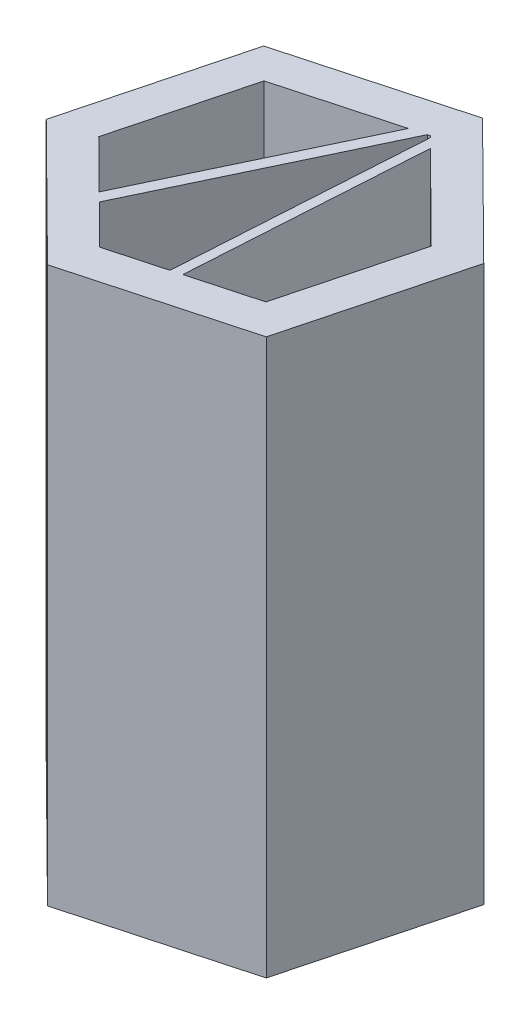
ISO-10303-21;
HEADER;
FILE_DESCRIPTION(('STEP AP214'),'2;1');
FILE_NAME('part.step','',(''),(''),'','','');
FILE_SCHEMA(('AUTOMOTIVE_DESIGN { 1 0 10303 214 1 1 1 1 }'));
ENDSEC;
DATA;
#1=APPLICATION_CONTEXT('core data for automotive mechanical design processes');
#2=APPLICATION_PROTOCOL_DEFINITION('international standard','automotive_design',2000,#1);
#3=PRODUCT_CONTEXT('',#1,'mechanical');
#4=PRODUCT('Part','Part','',(#3));
#5=PRODUCT_RELATED_PRODUCT_CATEGORY('part','',(#4));
#6=PRODUCT_DEFINITION_FORMATION('','',#4);
#7=PRODUCT_DEFINITION_CONTEXT('part definition',#1,'design');
#8=PRODUCT_DEFINITION('design','',#6,#7);
#9=PRODUCT_DEFINITION_SHAPE('','',#8);
#10=(LENGTH_UNIT() NAMED_UNIT(*) SI_UNIT(.MILLI.,.METRE.));
#11=(NAMED_UNIT(*) PLANE_ANGLE_UNIT() SI_UNIT($,.RADIAN.));
#12=(NAMED_UNIT(*) SI_UNIT($,.STERADIAN.) SOLID_ANGLE_UNIT());
#13=UNCERTAINTY_MEASURE_WITH_UNIT(LENGTH_MEASURE(1.E-05),#10,'distance_accuracy_value','');
#14=(GEOMETRIC_REPRESENTATION_CONTEXT(3) GLOBAL_UNCERTAINTY_ASSIGNED_CONTEXT((#13)) GLOBAL_UNIT_ASSIGNED_CONTEXT((#10,
#11,#12)) REPRESENTATION_CONTEXT('',''));
#15=CARTESIAN_POINT('',(0.,0.,0.));
#16=DIRECTION('',(0.,0.,1.));
#17=DIRECTION('',(1.,0.,0.));
#18=AXIS2_PLACEMENT_3D('',#15,#16,#17);
#19=CARTESIAN_POINT('',(-2.78587489391475,45.,10.6100063340598));
#20=DIRECTION('',(-0.263669614670392,0.,-0.964613048999217));
#21=DIRECTION('',(-0.964613048999218,0.,0.263669614670392));
#22=AXIS2_PLACEMENT_3D('',#19,#20,#21);
#23=PLANE('',#22);
#24=DIRECTION('',(0.,1.,0.));
#25=VECTOR('',#24,1.);
#26=CARTESIAN_POINT('',(1.68769548996965,0.,9.3871900135223));
#27=LINE('',#26,#25);
#28=CARTESIAN_POINT('',(1.68769548996966,0.,9.38719001352229));
#29=VERTEX_POINT('',#28);
#30=CARTESIAN_POINT('',(1.68769548996966,45.,9.38719001352229));
#31=VERTEX_POINT('',#30);
#32=EDGE_CURVE('E211',#29,#31,#27,.T.);
#33=ORIENTED_EDGE('',*,*,#32,.F.);
#34=DIRECTION('',(0.964613048999218,0.,-0.263669614670392));
#35=VECTOR('',#34,1.);
#36=CARTESIAN_POINT('',(-2.78587489391475,0.,10.6100063340598));
#37=LINE('',#36,#35);
#38=CARTESIAN_POINT('',(-2.78587489391475,0.,10.6100063340598));
#39=VERTEX_POINT('',#38);
#40=EDGE_CURVE('E275',#39,#29,#37,.T.);
#41=ORIENTED_EDGE('',*,*,#40,.F.);
#42=DIRECTION('',(0.,-1.,0.));
#43=VECTOR('',#42,1.);
#44=CARTESIAN_POINT('',(-2.78587489391475,45.,10.6100063340598));
#45=LINE('',#44,#43);
#46=CARTESIAN_POINT('',(-2.78587489391475,45.,10.6100063340598));
#47=VERTEX_POINT('',#46);
#48=EDGE_CURVE('E314',#47,#39,#45,.T.);
#49=ORIENTED_EDGE('',*,*,#48,.F.);
#50=DIRECTION('',(0.964613048999218,0.,-0.263669614670392));
#51=VECTOR('',#50,1.);
#52=CARTESIAN_POINT('',(-2.78587489391475,45.,10.6100063340598));
#53=LINE('',#52,#51);
#54=EDGE_CURVE('E55',#47,#31,#53,.T.);
#55=ORIENTED_EDGE('',*,*,#54,.T.);
#56=EDGE_LOOP('',(#33,#41,#49,#55));
#57=FACE_BOUND('',#56,.T.);
#58=ADVANCED_FACE('F39',(#57),#23,.T.);
#59=CARTESIAN_POINT('',(10.581472466567,45.,-2.89236473713444));
#60=DIRECTION('',(-0.703544597920089,0.,0.710651109010223));
#61=DIRECTION('',(0.710651109010223,0.,0.70354459792009));
#62=AXIS2_PLACEMENT_3D('',#59,#60,#61);
#63=PLANE('',#62);
#64=DIRECTION('',(0.,1.,0.));
#65=VECTOR('',#64,1.);
#66=CARTESIAN_POINT('',(2.92800511571679,0.,-10.4692974144758));
#67=LINE('',#66,#65);
#68=CARTESIAN_POINT('',(2.9280051157168,0.,-10.4692974144758));
#69=VERTEX_POINT('',#68);
#70=CARTESIAN_POINT('',(2.92800511571679,45.,-10.4692974144758));
#71=VERTEX_POINT('',#70);
#72=EDGE_CURVE('E215',#69,#71,#67,.T.);
#73=ORIENTED_EDGE('',*,*,#72,.T.);
#74=DIRECTION('',(-0.710651109010223,0.,-0.703544597920089));
#75=VECTOR('',#74,1.);
#76=CARTESIAN_POINT('',(10.581472466567,45.,-2.89236473713444));
#77=LINE('',#76,#75);
#78=CARTESIAN_POINT('',(2.78587489391475,45.,-10.6100063340598));
#79=VERTEX_POINT('',#78);
#80=EDGE_CURVE('E259',#71,#79,#77,.T.);
#81=ORIENTED_EDGE('',*,*,#80,.T.);
#82=DIRECTION('',(0.,-1.,0.));
#83=VECTOR('',#82,1.);
#84=CARTESIAN_POINT('',(2.78587489391475,45.,-10.6100063340598));
#85=LINE('',#84,#83);
#86=CARTESIAN_POINT('',(2.78587489391475,0.,-10.6100063340598));
#87=VERTEX_POINT('',#86);
#88=EDGE_CURVE('E304',#79,#87,#85,.T.);
#89=ORIENTED_EDGE('',*,*,#88,.T.);
#90=DIRECTION('',(-0.710651109010223,0.,-0.703544597920089));
#91=VECTOR('',#90,1.);
#92=CARTESIAN_POINT('',(10.581472466567,0.,-2.89236473713444));
#93=LINE('',#92,#91);
#94=EDGE_CURVE('E283',#69,#87,#93,.T.);
#95=ORIENTED_EDGE('',*,*,#94,.F.);
#96=EDGE_LOOP('',(#73,#81,#89,#95));
#97=FACE_BOUND('',#96,.T.);
#98=ADVANCED_FACE('F418',(#97),#63,.T.);
#99=CARTESIAN_POINT('',(-10.581472466567,45.,2.89236473713444));
#100=DIRECTION('',(0.70354459792009,0.,-0.710651109010223));
#101=DIRECTION('',(-0.710651109010223,0.,-0.70354459792009));
#102=AXIS2_PLACEMENT_3D('',#99,#100,#101);
#103=PLANE('',#102);
#104=DIRECTION('',(0.,1.,0.));
#105=VECTOR('',#104,1.);
#106=CARTESIAN_POINT('',(-6.68367368024085,0.,6.75118553559712));
#107=LINE('',#106,#105);
#108=CARTESIAN_POINT('',(-6.68367368024085,0.,6.75118553559712));
#109=VERTEX_POINT('',#108);
#110=CARTESIAN_POINT('',(-6.68367368024085,45.,6.75118553559712));
#111=VERTEX_POINT('',#110);
#112=EDGE_CURVE('E237',#109,#111,#107,.T.);
#113=ORIENTED_EDGE('',*,*,#112,.F.);
#114=DIRECTION('',(0.710651109010223,0.,0.70354459792009));
#115=VECTOR('',#114,1.);
#116=CARTESIAN_POINT('',(-10.581472466567,0.,2.89236473713444));
#117=LINE('',#116,#115);
#118=CARTESIAN_POINT('',(-10.581472466567,0.,2.89236473713444));
#119=VERTEX_POINT('',#118);
#120=EDGE_CURVE('E271',#119,#109,#117,.T.);
#121=ORIENTED_EDGE('',*,*,#120,.F.);
#122=DIRECTION('',(0.,-1.,0.));
#123=VECTOR('',#122,1.);
#124=CARTESIAN_POINT('',(-10.581472466567,45.,2.89236473713444));
#125=LINE('',#124,#123);
#126=CARTESIAN_POINT('',(-10.581472466567,45.,2.89236473713444));
#127=VERTEX_POINT('',#126);
#128=EDGE_CURVE('E270',#127,#119,#125,.T.);
#129=ORIENTED_EDGE('',*,*,#128,.F.);
#130=DIRECTION('',(0.710651109010223,0.,0.70354459792009));
#131=VECTOR('',#130,1.);
#132=CARTESIAN_POINT('',(-10.581472466567,45.,2.89236473713444));
#133=LINE('',#132,#131);
#134=EDGE_CURVE('E188',#127,#111,#133,.T.);
#135=ORIENTED_EDGE('',*,*,#134,.T.);
#136=EDGE_LOOP('',(#113,#121,#129,#135));
#137=FACE_BOUND('',#136,.T.);
#138=ADVANCED_FACE('F414',(#137),#103,.T.);
#139=CARTESIAN_POINT('',(2.78587489391475,45.,-10.6100063340598));
#140=DIRECTION('',(0.263669614670392,0.,0.964613048999218));
#141=DIRECTION('',(0.964613048999218,0.,-0.263669614670392));
#142=AXIS2_PLACEMENT_3D('',#139,#140,#141);
#143=PLANE('',#142);
#144=DIRECTION('',(0.,1.,0.));
#145=VECTOR('',#144,1.);
#146=CARTESIAN_POINT('',(1.39119043253521,0.,-10.2287799812749));
#147=LINE('',#146,#145);
#148=CARTESIAN_POINT('',(1.39119043253522,0.,-10.2287799812749));
#149=VERTEX_POINT('',#148);
#150=CARTESIAN_POINT('',(1.39119043253521,45.,-10.2287799812749));
#151=VERTEX_POINT('',#150);
#152=EDGE_CURVE('E242',#149,#151,#147,.T.);
#153=ORIENTED_EDGE('',*,*,#152,.T.);
#154=DIRECTION('',(-0.964613048999218,0.,0.263669614670392));
#155=VECTOR('',#154,1.);
#156=CARTESIAN_POINT('',(2.78587489391475,45.,-10.6100063340598));
#157=LINE('',#156,#155);
#158=CARTESIAN_POINT('',(-7.79559757265221,45.,-7.71764159692535));
#159=VERTEX_POINT('',#158);
#160=EDGE_CURVE('E263',#151,#159,#157,.T.);
#161=ORIENTED_EDGE('',*,*,#160,.T.);
#162=DIRECTION('',(0.,-1.,0.));
#163=VECTOR('',#162,1.);
#164=CARTESIAN_POINT('',(-7.79559757265221,45.,-7.71764159692535));
#165=LINE('',#164,#163);
#166=CARTESIAN_POINT('',(-7.79559757265221,0.,-7.71764159692535));
#167=VERTEX_POINT('',#166);
#168=EDGE_CURVE('E300',#159,#167,#165,.T.);
#169=ORIENTED_EDGE('',*,*,#168,.T.);
#170=DIRECTION('',(-0.964613048999218,0.,0.263669614670392));
#171=VECTOR('',#170,1.);
#172=CARTESIAN_POINT('',(2.78587489391475,0.,-10.6100063340598));
#173=LINE('',#172,#171);
#174=EDGE_CURVE('E288',#149,#167,#173,.T.);
#175=ORIENTED_EDGE('',*,*,#174,.F.);
#176=EDGE_LOOP('',(#153,#161,#169,#175));
#177=FACE_BOUND('',#176,.T.);
#178=ADVANCED_FACE('F444',(#177),#143,.T.);
#179=CARTESIAN_POINT('',(0.,45.,0.));
#180=DIRECTION('',(0.,1.,0.));
#181=DIRECTION('',(0.,0.,1.));
#182=AXIS2_PLACEMENT_3D('',#179,#180,#181);
#183=PLANE('',#182);
#184=CARTESIAN_POINT('',(2.50486133936873,45.,9.16382396549257));
#185=VERTEX_POINT('',#184);
#186=CARTESIAN_POINT('',(7.79559757265221,45.,7.71764159692535));
#187=VERTEX_POINT('',#186);
#188=EDGE_CURVE('E179',#185,#187,#53,.T.);
#189=ORIENTED_EDGE('',*,*,#188,.F.);
#190=DIRECTION('',(0.0623421952906192,0.,-0.99805483350683));
#191=VECTOR('',#190,1.);
#192=CARTESIAN_POINT('',(2.50486133936873,45.,9.16382396549257));
#193=LINE('',#192,#191);
#194=CARTESIAN_POINT('',(3.6844413873926,45.,-9.72042550551676));
#195=VERTEX_POINT('',#194);
#196=EDGE_CURVE('E184',#185,#195,#193,.T.);
#197=ORIENTED_EDGE('',*,*,#196,.T.);
#198=CARTESIAN_POINT('',(10.581472466567,45.,-2.89236473713444));
#199=VERTEX_POINT('',#198);
#200=EDGE_CURVE('E260',#199,#195,#77,.T.);
#201=ORIENTED_EDGE('',*,*,#200,.F.);
#202=DIRECTION('',(0.253961939988995,0.,-0.967214212590482));
#203=VECTOR('',#202,1.);
#204=CARTESIAN_POINT('',(7.79559757265221,45.,7.71764159692535));
#205=LINE('',#204,#203);
#206=EDGE_CURVE('E185',#187,#199,#205,.T.);
#207=ORIENTED_EDGE('',*,*,#206,.F.);
#208=EDGE_LOOP('',(#189,#197,#201,#207));
#209=FACE_BOUND('',#208,.T.);
#210=CARTESIAN_POINT('',(-5.97280295493348,45.,7.45494755365139));
#211=VERTEX_POINT('',#210);
#212=EDGE_CURVE('E254',#211,#47,#133,.T.);
#213=ORIENTED_EDGE('',*,*,#212,.F.);
#214=DIRECTION('',(0.429463831903045,0.,-0.903084058705032));
#215=VECTOR('',#214,1.);
#216=CARTESIAN_POINT('',(2.59295228411491,45.,-10.5572724111257));
#217=LINE('',#216,#215);
#218=CARTESIAN_POINT('',(2.59295228411491,45.,-10.5572724111257));
#219=VERTEX_POINT('',#218);
#220=EDGE_CURVE('E214',#211,#219,#217,.T.);
#221=ORIENTED_EDGE('',*,*,#220,.T.);
#222=EDGE_CURVE('E264',#79,#219,#157,.T.);
#223=ORIENTED_EDGE('',*,*,#222,.F.);
#224=ORIENTED_EDGE('',*,*,#80,.F.);
#225=DIRECTION('',(-0.0623421952906192,0.,0.99805483350683));
#226=VECTOR('',#225,1.);
#227=CARTESIAN_POINT('',(2.92800511571679,45.,-10.4692974144758));
#228=LINE('',#227,#226);
#229=EDGE_CURVE('E202',#71,#31,#228,.T.);
#230=ORIENTED_EDGE('',*,*,#229,.T.);
#231=ORIENTED_EDGE('',*,*,#54,.F.);
#232=EDGE_LOOP('',(#213,#221,#223,#224,#230,#231));
#233=FACE_BOUND('',#232,.T.);
#234=DIRECTION('',(0.964613048999218,0.,-0.263669614670393));
#235=VECTOR('',#234,1.);
#236=CARTESIAN_POINT('',(-3.66562486041414,45.,13.9605346500787));
#237=LINE('',#236,#235);
#238=CARTESIAN_POINT('',(-3.66562486041414,45.,13.9605346500787));
#239=VERTEX_POINT('',#238);
#240=CARTESIAN_POINT('',(10.257365227174,45.,10.1547915749018));
#241=VERTEX_POINT('',#240);
#242=EDGE_CURVE('E319',#239,#241,#237,.T.);
#243=ORIENTED_EDGE('',*,*,#242,.T.);
#244=DIRECTION('',(0.253961939988995,0.,-0.967214212590482));
#245=VECTOR('',#244,1.);
#246=CARTESIAN_POINT('',(10.257365227174,45.,10.1547915749018));
#247=LINE('',#246,#245);
#248=CARTESIAN_POINT('',(13.9229900875881,45.,-3.8057430751769));
#249=VERTEX_POINT('',#248);
#250=EDGE_CURVE('E323',#241,#249,#247,.T.);
#251=ORIENTED_EDGE('',*,*,#250,.T.);
#252=DIRECTION('',(-0.710651109010223,0.,-0.70354459792009));
#253=VECTOR('',#252,1.);
#254=CARTESIAN_POINT('',(13.9229900875881,45.,-3.8057430751769));
#255=LINE('',#254,#253);
#256=CARTESIAN_POINT('',(3.66562486041415,45.,-13.9605346500787));
#257=VERTEX_POINT('',#256);
#258=EDGE_CURVE('E327',#249,#257,#255,.T.);
#259=ORIENTED_EDGE('',*,*,#258,.T.);
#260=DIRECTION('',(-0.964613048999218,0.,0.263669614670392));
#261=VECTOR('',#260,1.);
#262=CARTESIAN_POINT('',(3.66562486041415,45.,-13.9605346500787));
#263=LINE('',#262,#261);
#264=CARTESIAN_POINT('',(-10.257365227174,45.,-10.1547915749018));
#265=VERTEX_POINT('',#264);
#266=EDGE_CURVE('E330',#257,#265,#263,.T.);
#267=ORIENTED_EDGE('',*,*,#266,.T.);
#268=DIRECTION('',(-0.253961939988995,0.,0.967214212590482));
#269=VECTOR('',#268,1.);
#270=CARTESIAN_POINT('',(-10.257365227174,45.,-10.1547915749018));
#271=LINE('',#270,#269);
#272=CARTESIAN_POINT('',(-13.9229900875881,45.,3.8057430751769));
#273=VERTEX_POINT('',#272);
#274=EDGE_CURVE('E333',#265,#273,#271,.T.);
#275=ORIENTED_EDGE('',*,*,#274,.T.);
#276=DIRECTION('',(0.710651109010223,0.,0.70354459792009));
#277=VECTOR('',#276,1.);
#278=CARTESIAN_POINT('',(-13.9229900875881,45.,3.8057430751769));
#279=LINE('',#278,#277);
#280=EDGE_CURVE('E336',#273,#239,#279,.T.);
#281=ORIENTED_EDGE('',*,*,#280,.T.);
#282=EDGE_LOOP('',(#243,#251,#259,#267,#275,#281));
#283=FACE_BOUND('',#282,.T.);
#284=DIRECTION('',(-0.429463831903045,0.,0.903084058705031));
#285=VECTOR('',#284,1.);
#286=CARTESIAN_POINT('',(-6.68367368024085,45.,6.75118553559712));
#287=LINE('',#286,#285);
#288=EDGE_CURVE('E226',#151,#111,#287,.T.);
#289=ORIENTED_EDGE('',*,*,#288,.T.);
#290=ORIENTED_EDGE('',*,*,#134,.F.);
#291=DIRECTION('',(-0.253961939988995,0.,0.967214212590482));
#292=VECTOR('',#291,1.);
#293=CARTESIAN_POINT('',(-7.79559757265221,45.,-7.71764159692535));
#294=LINE('',#293,#292);
#295=EDGE_CURVE('E267',#159,#127,#294,.T.);
#296=ORIENTED_EDGE('',*,*,#295,.F.);
#297=ORIENTED_EDGE('',*,*,#160,.F.);
#298=EDGE_LOOP('',(#289,#290,#296,#297));
#299=FACE_BOUND('',#298,.T.);
#300=ADVANCED_FACE('F180',(#209,#233,#283,#299),#183,.T.);
#301=CARTESIAN_POINT('',(0.,0.,0.));
#302=DIRECTION('',(0.,1.,0.));
#303=DIRECTION('',(0.,0.,1.));
#304=AXIS2_PLACEMENT_3D('',#301,#302,#303);
#305=PLANE('',#304);
#306=DIRECTION('',(0.0623421952906192,0.,-0.99805483350683));
#307=VECTOR('',#306,1.);
#308=CARTESIAN_POINT('',(2.50486133936873,0.,9.16382396549257));
#309=LINE('',#308,#307);
#310=CARTESIAN_POINT('',(2.50486133936873,0.,9.16382396549257));
#311=VERTEX_POINT('',#310);
#312=CARTESIAN_POINT('',(3.6844413873926,0.,-9.72042550551676));
#313=VERTEX_POINT('',#312);
#314=EDGE_CURVE('E206',#311,#313,#309,.T.);
#315=ORIENTED_EDGE('',*,*,#314,.F.);
#316=CARTESIAN_POINT('',(7.79559757265221,0.,7.71764159692535));
#317=VERTEX_POINT('',#316);
#318=EDGE_CURVE('E63',#311,#317,#37,.T.);
#319=ORIENTED_EDGE('',*,*,#318,.T.);
#320=DIRECTION('',(0.253961939988995,0.,-0.967214212590482));
#321=VECTOR('',#320,1.);
#322=CARTESIAN_POINT('',(7.79559757265221,0.,7.71764159692535));
#323=LINE('',#322,#321);
#324=CARTESIAN_POINT('',(10.581472466567,0.,-2.89236473713444));
#325=VERTEX_POINT('',#324);
#326=EDGE_CURVE('E279',#317,#325,#323,.T.);
#327=ORIENTED_EDGE('',*,*,#326,.T.);
#328=EDGE_CURVE('E284',#325,#313,#93,.T.);
#329=ORIENTED_EDGE('',*,*,#328,.T.);
#330=EDGE_LOOP('',(#315,#319,#327,#329));
#331=FACE_BOUND('',#330,.T.);
#332=DIRECTION('',(0.429463831903045,0.,-0.903084058705032));
#333=VECTOR('',#332,1.);
#334=CARTESIAN_POINT('',(2.59295228411491,0.,-10.5572724111257));
#335=LINE('',#334,#333);
#336=CARTESIAN_POINT('',(-5.97280295493348,0.,7.45494755365139));
#337=VERTEX_POINT('',#336);
#338=CARTESIAN_POINT('',(2.59295228411491,0.,-10.5572724111257));
#339=VERTEX_POINT('',#338);
#340=EDGE_CURVE('E221',#337,#339,#335,.T.);
#341=ORIENTED_EDGE('',*,*,#340,.F.);
#342=EDGE_CURVE('E241',#337,#39,#117,.T.);
#343=ORIENTED_EDGE('',*,*,#342,.T.);
#344=ORIENTED_EDGE('',*,*,#40,.T.);
#345=DIRECTION('',(-0.0623421952906192,0.,0.99805483350683));
#346=VECTOR('',#345,1.);
#347=CARTESIAN_POINT('',(2.92800511571679,0.,-10.4692974144758));
#348=LINE('',#347,#346);
#349=EDGE_CURVE('E197',#69,#29,#348,.T.);
#350=ORIENTED_EDGE('',*,*,#349,.F.);
#351=ORIENTED_EDGE('',*,*,#94,.T.);
#352=EDGE_CURVE('E289',#87,#339,#173,.T.);
#353=ORIENTED_EDGE('',*,*,#352,.T.);
#354=EDGE_LOOP('',(#341,#343,#344,#350,#351,#353));
#355=FACE_BOUND('',#354,.T.);
#356=DIRECTION('',(0.964613048999218,0.,-0.263669614670393));
#357=VECTOR('',#356,1.);
#358=CARTESIAN_POINT('',(-3.66562486041414,0.,13.9605346500787));
#359=LINE('',#358,#357);
#360=CARTESIAN_POINT('',(-3.66562486041414,0.,13.9605346500787));
#361=VERTEX_POINT('',#360);
#362=CARTESIAN_POINT('',(10.257365227174,0.,10.1547915749018));
#363=VERTEX_POINT('',#362);
#364=EDGE_CURVE('E318',#361,#363,#359,.T.);
#365=ORIENTED_EDGE('',*,*,#364,.F.);
#366=DIRECTION('',(0.710651109010223,0.,0.70354459792009));
#367=VECTOR('',#366,1.);
#368=CARTESIAN_POINT('',(-13.9229900875881,0.,3.8057430751769));
#369=LINE('',#368,#367);
#370=CARTESIAN_POINT('',(-13.9229900875881,0.,3.8057430751769));
#371=VERTEX_POINT('',#370);
#372=EDGE_CURVE('E324',#371,#361,#369,.T.);
#373=ORIENTED_EDGE('',*,*,#372,.F.);
#374=DIRECTION('',(-0.253961939988995,0.,0.967214212590482));
#375=VECTOR('',#374,1.);
#376=CARTESIAN_POINT('',(-10.257365227174,0.,-10.1547915749018));
#377=LINE('',#376,#375);
#378=CARTESIAN_POINT('',(-10.257365227174,0.,-10.1547915749018));
#379=VERTEX_POINT('',#378);
#380=EDGE_CURVE('E352',#379,#371,#377,.T.);
#381=ORIENTED_EDGE('',*,*,#380,.F.);
#382=DIRECTION('',(-0.964613048999218,0.,0.263669614670392));
#383=VECTOR('',#382,1.);
#384=CARTESIAN_POINT('',(3.66562486041415,0.,-13.9605346500787));
#385=LINE('',#384,#383);
#386=CARTESIAN_POINT('',(3.66562486041415,0.,-13.9605346500787));
#387=VERTEX_POINT('',#386);
#388=EDGE_CURVE('E349',#387,#379,#385,.T.);
#389=ORIENTED_EDGE('',*,*,#388,.F.);
#390=DIRECTION('',(-0.710651109010223,0.,-0.70354459792009));
#391=VECTOR('',#390,1.);
#392=CARTESIAN_POINT('',(13.9229900875881,0.,-3.8057430751769));
#393=LINE('',#392,#391);
#394=CARTESIAN_POINT('',(13.9229900875881,0.,-3.8057430751769));
#395=VERTEX_POINT('',#394);
#396=EDGE_CURVE('E346',#395,#387,#393,.T.);
#397=ORIENTED_EDGE('',*,*,#396,.F.);
#398=DIRECTION('',(0.253961939988995,0.,-0.967214212590482));
#399=VECTOR('',#398,1.);
#400=CARTESIAN_POINT('',(10.257365227174,0.,10.1547915749018));
#401=LINE('',#400,#399);
#402=EDGE_CURVE('E343',#363,#395,#401,.T.);
#403=ORIENTED_EDGE('',*,*,#402,.F.);
#404=EDGE_LOOP('',(#365,#373,#381,#389,#397,#403));
#405=FACE_BOUND('',#404,.T.);
#406=ORIENTED_EDGE('',*,*,#120,.T.);
#407=DIRECTION('',(-0.429463831903045,0.,0.903084058705031));
#408=VECTOR('',#407,1.);
#409=CARTESIAN_POINT('',(-6.68367368024085,0.,6.75118553559712));
#410=LINE('',#409,#408);
#411=EDGE_CURVE('E225',#149,#109,#410,.T.);
#412=ORIENTED_EDGE('',*,*,#411,.F.);
#413=ORIENTED_EDGE('',*,*,#174,.T.);
#414=DIRECTION('',(-0.253961939988995,0.,0.967214212590482));
#415=VECTOR('',#414,1.);
#416=CARTESIAN_POINT('',(-7.79559757265221,0.,-7.71764159692535));
#417=LINE('',#416,#415);
#418=EDGE_CURVE('E293',#167,#119,#417,.T.);
#419=ORIENTED_EDGE('',*,*,#418,.T.);
#420=EDGE_LOOP('',(#406,#412,#413,#419));
#421=FACE_BOUND('',#420,.T.);
#422=ADVANCED_FACE('F383',(#331,#355,#405,#421),#305,.F.);
#423=CARTESIAN_POINT('',(-3.66562486041414,45.,13.9605346500787));
#424=DIRECTION('',(-0.263669614670393,0.,-0.964613048999217));
#425=DIRECTION('',(-0.964613048999217,0.,0.263669614670393));
#426=AXIS2_PLACEMENT_3D('',#423,#424,#425);
#427=PLANE('',#426);
#428=ORIENTED_EDGE('',*,*,#364,.T.);
#429=DIRECTION('',(0.,-1.,0.));
#430=VECTOR('',#429,1.);
#431=CARTESIAN_POINT('',(10.257365227174,45.,10.1547915749018));
#432=LINE('',#431,#430);
#433=EDGE_CURVE('E11',#241,#363,#432,.T.);
#434=ORIENTED_EDGE('',*,*,#433,.F.);
#435=ORIENTED_EDGE('',*,*,#242,.F.);
#436=DIRECTION('',(0.,-1.,0.));
#437=VECTOR('',#436,1.);
#438=CARTESIAN_POINT('',(-3.66562486041414,45.,13.9605346500787));
#439=LINE('',#438,#437);
#440=EDGE_CURVE('E339',#239,#361,#439,.T.);
#441=ORIENTED_EDGE('',*,*,#440,.T.);
#442=EDGE_LOOP('',(#428,#434,#435,#441));
#443=FACE_BOUND('',#442,.T.);
#444=ADVANCED_FACE('F41',(#443),#427,.F.);
#445=CARTESIAN_POINT('',(10.257365227174,45.,10.1547915749018));
#446=DIRECTION('',(-0.967214212590482,0.,-0.253961939988995));
#447=DIRECTION('',(-0.253961939988995,0.,0.967214212590482));
#448=AXIS2_PLACEMENT_3D('',#445,#446,#447);
#449=PLANE('',#448);
#450=ORIENTED_EDGE('',*,*,#402,.T.);
#451=DIRECTION('',(0.,-1.,0.));
#452=VECTOR('',#451,1.);
#453=CARTESIAN_POINT('',(13.9229900875881,45.,-3.8057430751769));
#454=LINE('',#453,#452);
#455=EDGE_CURVE('E48',#249,#395,#454,.T.);
#456=ORIENTED_EDGE('',*,*,#455,.F.);
#457=ORIENTED_EDGE('',*,*,#250,.F.);
#458=ORIENTED_EDGE('',*,*,#433,.T.);
#459=EDGE_LOOP('',(#450,#456,#457,#458));
#460=FACE_BOUND('',#459,.T.);
#461=ADVANCED_FACE('F401',(#460),#449,.F.);
#462=CARTESIAN_POINT('',(13.9229900875881,45.,-3.8057430751769));
#463=DIRECTION('',(-0.70354459792009,0.,0.710651109010223));
#464=DIRECTION('',(0.710651109010223,0.,0.70354459792009));
#465=AXIS2_PLACEMENT_3D('',#462,#463,#464);
#466=PLANE('',#465);
#467=ORIENTED_EDGE('',*,*,#396,.T.);
#468=DIRECTION('',(0.,-1.,0.));
#469=VECTOR('',#468,1.);
#470=CARTESIAN_POINT('',(3.66562486041415,45.,-13.9605346500787));
#471=LINE('',#470,#469);
#472=EDGE_CURVE('E368',#257,#387,#471,.T.);
#473=ORIENTED_EDGE('',*,*,#472,.F.);
#474=ORIENTED_EDGE('',*,*,#258,.F.);
#475=ORIENTED_EDGE('',*,*,#455,.T.);
#476=EDGE_LOOP('',(#467,#473,#474,#475));
#477=FACE_BOUND('',#476,.T.);
#478=ADVANCED_FACE('F377',(#477),#466,.F.);
#479=CARTESIAN_POINT('',(3.66562486041415,45.,-13.9605346500787));
#480=DIRECTION('',(0.263669614670392,0.,0.964613048999217));
#481=DIRECTION('',(0.964613048999218,0.,-0.263669614670392));
#482=AXIS2_PLACEMENT_3D('',#479,#480,#481);
#483=PLANE('',#482);
#484=ORIENTED_EDGE('',*,*,#388,.T.);
#485=DIRECTION('',(0.,-1.,0.));
#486=VECTOR('',#485,1.);
#487=CARTESIAN_POINT('',(-10.257365227174,45.,-10.1547915749018));
#488=LINE('',#487,#486);
#489=EDGE_CURVE('E364',#265,#379,#488,.T.);
#490=ORIENTED_EDGE('',*,*,#489,.F.);
#491=ORIENTED_EDGE('',*,*,#266,.F.);
#492=ORIENTED_EDGE('',*,*,#472,.T.);
#493=EDGE_LOOP('',(#484,#490,#491,#492));
#494=FACE_BOUND('',#493,.T.);
#495=ADVANCED_FACE('F389',(#494),#483,.F.);
#496=CARTESIAN_POINT('',(-10.257365227174,45.,-10.1547915749018));
#497=DIRECTION('',(0.967214212590482,0.,0.253961939988995));
#498=DIRECTION('',(0.253961939988995,0.,-0.967214212590482));
#499=AXIS2_PLACEMENT_3D('',#496,#497,#498);
#500=PLANE('',#499);
#501=ORIENTED_EDGE('',*,*,#380,.T.);
#502=DIRECTION('',(0.,-1.,0.));
#503=VECTOR('',#502,1.);
#504=CARTESIAN_POINT('',(-13.9229900875881,45.,3.8057430751769));
#505=LINE('',#504,#503);
#506=EDGE_CURVE('E360',#273,#371,#505,.T.);
#507=ORIENTED_EDGE('',*,*,#506,.F.);
#508=ORIENTED_EDGE('',*,*,#274,.F.);
#509=ORIENTED_EDGE('',*,*,#489,.T.);
#510=EDGE_LOOP('',(#501,#507,#508,#509));
#511=FACE_BOUND('',#510,.T.);
#512=ADVANCED_FACE('F393',(#511),#500,.F.);
#513=CARTESIAN_POINT('',(-13.9229900875881,45.,3.8057430751769));
#514=DIRECTION('',(0.70354459792009,0.,-0.710651109010223));
#515=DIRECTION('',(-0.710651109010223,0.,-0.70354459792009));
#516=AXIS2_PLACEMENT_3D('',#513,#514,#515);
#517=PLANE('',#516);
#518=ORIENTED_EDGE('',*,*,#372,.T.);
#519=ORIENTED_EDGE('',*,*,#440,.F.);
#520=ORIENTED_EDGE('',*,*,#280,.F.);
#521=ORIENTED_EDGE('',*,*,#506,.T.);
#522=EDGE_LOOP('',(#518,#519,#520,#521));
#523=FACE_BOUND('',#522,.T.);
#524=ADVANCED_FACE('F404',(#523),#517,.F.);
#525=DIRECTION('',(0.,1.,0.));
#526=VECTOR('',#525,1.);
#527=CARTESIAN_POINT('',(-5.97280295493348,0.,7.45494755365139));
#528=LINE('',#527,#526);
#529=EDGE_CURVE('E230',#337,#211,#528,.T.);
#530=ORIENTED_EDGE('',*,*,#529,.T.);
#531=ORIENTED_EDGE('',*,*,#212,.T.);
#532=ORIENTED_EDGE('',*,*,#48,.T.);
#533=ORIENTED_EDGE('',*,*,#342,.F.);
#534=EDGE_LOOP('',(#530,#531,#532,#533));
#535=FACE_BOUND('',#534,.T.);
#536=ADVANCED_FACE('F406',(#535),#103,.T.);
#537=DIRECTION('',(0.,1.,0.));
#538=VECTOR('',#537,1.);
#539=CARTESIAN_POINT('',(2.50486133936873,0.,9.16382396549257));
#540=LINE('',#539,#538);
#541=EDGE_CURVE('E190',#311,#185,#540,.T.);
#542=ORIENTED_EDGE('',*,*,#541,.T.);
#543=ORIENTED_EDGE('',*,*,#188,.T.);
#544=DIRECTION('',(0.,-1.,0.));
#545=VECTOR('',#544,1.);
#546=CARTESIAN_POINT('',(7.79559757265221,45.,7.71764159692535));
#547=LINE('',#546,#545);
#548=EDGE_CURVE('E311',#187,#317,#547,.T.);
#549=ORIENTED_EDGE('',*,*,#548,.T.);
#550=ORIENTED_EDGE('',*,*,#318,.F.);
#551=EDGE_LOOP('',(#542,#543,#549,#550));
#552=FACE_BOUND('',#551,.T.);
#553=ADVANCED_FACE('F191',(#552),#23,.T.);
#554=CARTESIAN_POINT('',(7.79559757265221,45.,7.71764159692535));
#555=DIRECTION('',(-0.967214212590482,0.,-0.253961939988995));
#556=DIRECTION('',(-0.253961939988995,0.,0.967214212590482));
#557=AXIS2_PLACEMENT_3D('',#554,#555,#556);
#558=PLANE('',#557);
#559=ORIENTED_EDGE('',*,*,#326,.F.);
#560=ORIENTED_EDGE('',*,*,#548,.F.);
#561=ORIENTED_EDGE('',*,*,#206,.T.);
#562=DIRECTION('',(0.,-1.,0.));
#563=VECTOR('',#562,1.);
#564=CARTESIAN_POINT('',(10.581472466567,45.,-2.89236473713444));
#565=LINE('',#564,#563);
#566=EDGE_CURVE('E308',#199,#325,#565,.T.);
#567=ORIENTED_EDGE('',*,*,#566,.T.);
#568=EDGE_LOOP('',(#559,#560,#561,#567));
#569=FACE_BOUND('',#568,.T.);
#570=ADVANCED_FACE('F428',(#569),#558,.T.);
#571=DIRECTION('',(0.,1.,0.));
#572=VECTOR('',#571,1.);
#573=CARTESIAN_POINT('',(3.68444138739259,0.,-9.72042550551676));
#574=LINE('',#573,#572);
#575=EDGE_CURVE('E196',#313,#195,#574,.T.);
#576=ORIENTED_EDGE('',*,*,#575,.F.);
#577=ORIENTED_EDGE('',*,*,#328,.F.);
#578=ORIENTED_EDGE('',*,*,#566,.F.);
#579=ORIENTED_EDGE('',*,*,#200,.T.);
#580=EDGE_LOOP('',(#576,#577,#578,#579));
#581=FACE_BOUND('',#580,.T.);
#582=ADVANCED_FACE('F425',(#581),#63,.T.);
#583=DIRECTION('',(0.,1.,0.));
#584=VECTOR('',#583,1.);
#585=CARTESIAN_POINT('',(2.59295228411491,0.,-10.5572724111257));
#586=LINE('',#585,#584);
#587=EDGE_CURVE('E246',#339,#219,#586,.T.);
#588=ORIENTED_EDGE('',*,*,#587,.F.);
#589=ORIENTED_EDGE('',*,*,#352,.F.);
#590=ORIENTED_EDGE('',*,*,#88,.F.);
#591=ORIENTED_EDGE('',*,*,#222,.T.);
#592=EDGE_LOOP('',(#588,#589,#590,#591));
#593=FACE_BOUND('',#592,.T.);
#594=ADVANCED_FACE('F436',(#593),#143,.T.);
#595=CARTESIAN_POINT('',(-7.79559757265221,45.,-7.71764159692535));
#596=DIRECTION('',(0.967214212590482,0.,0.253961939988995));
#597=DIRECTION('',(0.253961939988995,0.,-0.967214212590482));
#598=AXIS2_PLACEMENT_3D('',#595,#596,#597);
#599=PLANE('',#598);
#600=ORIENTED_EDGE('',*,*,#418,.F.);
#601=ORIENTED_EDGE('',*,*,#168,.F.);
#602=ORIENTED_EDGE('',*,*,#295,.T.);
#603=ORIENTED_EDGE('',*,*,#128,.T.);
#604=EDGE_LOOP('',(#600,#601,#602,#603));
#605=FACE_BOUND('',#604,.T.);
#606=ADVANCED_FACE('F442',(#605),#599,.T.);
#607=CARTESIAN_POINT('',(-6.68367368024085,0.,6.75118553559712));
#608=DIRECTION('',(-0.903084058705032,0.,-0.429463831903045));
#609=DIRECTION('',(-0.429463831903045,0.,0.903084058705032));
#610=AXIS2_PLACEMENT_3D('',#607,#608,#609);
#611=PLANE('',#610);
#612=ORIENTED_EDGE('',*,*,#288,.F.);
#613=ORIENTED_EDGE('',*,*,#152,.F.);
#614=ORIENTED_EDGE('',*,*,#411,.T.);
#615=ORIENTED_EDGE('',*,*,#112,.T.);
#616=EDGE_LOOP('',(#612,#613,#614,#615));
#617=FACE_BOUND('',#616,.T.);
#618=ADVANCED_FACE('F447',(#617),#611,.T.);
#619=CARTESIAN_POINT('',(2.59295228411491,0.,-10.5572724111257));
#620=DIRECTION('',(0.903084058705032,0.,0.429463831903045));
#621=DIRECTION('',(0.429463831903045,0.,-0.903084058705032));
#622=AXIS2_PLACEMENT_3D('',#619,#620,#621);
#623=PLANE('',#622);
#624=ORIENTED_EDGE('',*,*,#220,.F.);
#625=ORIENTED_EDGE('',*,*,#529,.F.);
#626=ORIENTED_EDGE('',*,*,#340,.T.);
#627=ORIENTED_EDGE('',*,*,#587,.T.);
#628=EDGE_LOOP('',(#624,#625,#626,#627));
#629=FACE_BOUND('',#628,.T.);
#630=ADVANCED_FACE('F449',(#629),#623,.T.);
#631=CARTESIAN_POINT('',(2.92800511571679,0.,-10.4692974144758));
#632=DIRECTION('',(-0.99805483350683,0.,-0.0623421952906191));
#633=DIRECTION('',(-0.0623421952906192,0.,0.99805483350683));
#634=AXIS2_PLACEMENT_3D('',#631,#632,#633);
#635=PLANE('',#634);
#636=ORIENTED_EDGE('',*,*,#229,.F.);
#637=ORIENTED_EDGE('',*,*,#72,.F.);
#638=ORIENTED_EDGE('',*,*,#349,.T.);
#639=ORIENTED_EDGE('',*,*,#32,.T.);
#640=EDGE_LOOP('',(#636,#637,#638,#639));
#641=FACE_BOUND('',#640,.T.);
#642=ADVANCED_FACE('F452',(#641),#635,.T.);
#643=CARTESIAN_POINT('',(2.50486133936873,0.,9.16382396549257));
#644=DIRECTION('',(0.99805483350683,0.,0.0623421952906192));
#645=DIRECTION('',(0.0623421952906192,0.,-0.99805483350683));
#646=AXIS2_PLACEMENT_3D('',#643,#644,#645);
#647=PLANE('',#646);
#648=ORIENTED_EDGE('',*,*,#196,.F.);
#649=ORIENTED_EDGE('',*,*,#541,.F.);
#650=ORIENTED_EDGE('',*,*,#314,.T.);
#651=ORIENTED_EDGE('',*,*,#575,.T.);
#652=EDGE_LOOP('',(#648,#649,#650,#651));
#653=FACE_BOUND('',#652,.T.);
#654=ADVANCED_FACE('F200',(#653),#647,.T.);
#655=CLOSED_SHELL('',(#58,#98,#138,#178,#300,#422,#444,#461,#478,#495,#512,#524,#536,#553,#570,
#582,#594,#606,#618,#630,#642,#654));
#656=MANIFOLD_SOLID_BREP('B2',#655);
#657=ADVANCED_BREP_SHAPE_REPRESENTATION('',(#18,#656),#14);
#658=SHAPE_DEFINITION_REPRESENTATION(#9,#657);
ENDSEC;
END-ISO-10303-21;
